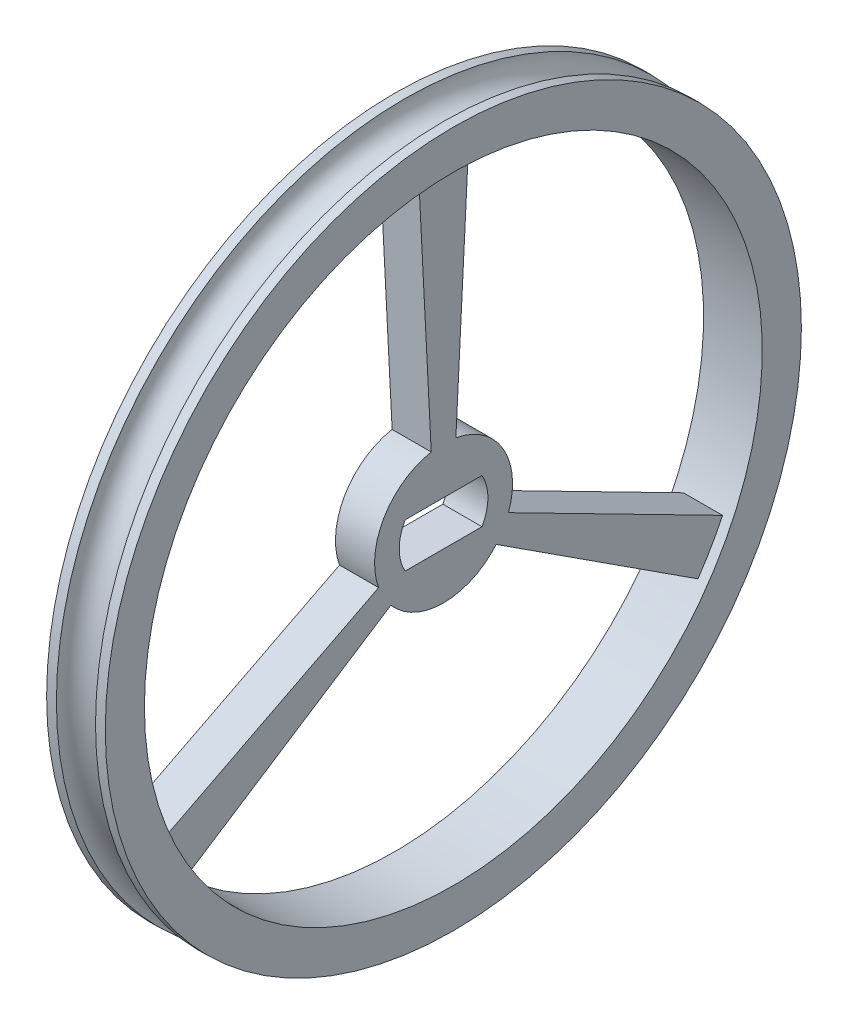
ISO-10303-21;
HEADER;
FILE_DESCRIPTION(('STEP AP214'),'2;1');
FILE_NAME('part.step','',(''),(''),'','','');
FILE_SCHEMA(('AUTOMOTIVE_DESIGN { 1 0 10303 214 1 1 1 1 }'));
ENDSEC;
DATA;
#1=APPLICATION_CONTEXT('core data for automotive mechanical design processes');
#2=APPLICATION_PROTOCOL_DEFINITION('international standard','automotive_design',2000,#1);
#3=PRODUCT_CONTEXT('',#1,'mechanical');
#4=PRODUCT('Part','Part','',(#3));
#5=PRODUCT_RELATED_PRODUCT_CATEGORY('part','',(#4));
#6=PRODUCT_DEFINITION_FORMATION('','',#4);
#7=PRODUCT_DEFINITION_CONTEXT('part definition',#1,'design');
#8=PRODUCT_DEFINITION('design','',#6,#7);
#9=PRODUCT_DEFINITION_SHAPE('','',#8);
#10=(LENGTH_UNIT() NAMED_UNIT(*) SI_UNIT(.MILLI.,.METRE.));
#11=(NAMED_UNIT(*) PLANE_ANGLE_UNIT() SI_UNIT($,.RADIAN.));
#12=(NAMED_UNIT(*) SI_UNIT($,.STERADIAN.) SOLID_ANGLE_UNIT());
#13=UNCERTAINTY_MEASURE_WITH_UNIT(LENGTH_MEASURE(1.E-05),#10,'distance_accuracy_value','');
#14=(GEOMETRIC_REPRESENTATION_CONTEXT(3) GLOBAL_UNCERTAINTY_ASSIGNED_CONTEXT((#13)) GLOBAL_UNIT_ASSIGNED_CONTEXT((#10,
#11,#12)) REPRESENTATION_CONTEXT('',''));
#15=CARTESIAN_POINT('',(0.,0.,0.));
#16=DIRECTION('',(0.,0.,1.));
#17=DIRECTION('',(1.,0.,0.));
#18=AXIS2_PLACEMENT_3D('',#15,#16,#17);
#19=CARTESIAN_POINT('',(0.,0.,0.));
#20=DIRECTION('',(-1.,0.,0.));
#21=DIRECTION('',(0.,0.,1.));
#22=AXIS2_PLACEMENT_3D('',#19,#20,#21);
#23=TOROIDAL_SURFACE('',#22,28.2575,1.5875);
#24=CARTESIAN_POINT('',(-1.5875,0.,0.));
#25=DIRECTION('',(-1.,0.,0.));
#26=DIRECTION('',(0.,0.,1.));
#27=AXIS2_PLACEMENT_3D('',#24,#25,#26);
#28=CIRCLE('',#27,28.2575);
#29=CARTESIAN_POINT('',(-1.5875,0.,28.2575));
#30=VERTEX_POINT('',#29);
#31=EDGE_CURVE('E11',#30,#30,#28,.T.);
#32=ORIENTED_EDGE('',*,*,#31,.F.);
#33=EDGE_LOOP('',(#32));
#34=FACE_BOUND('',#33,.T.);
#35=CARTESIAN_POINT('',(1.5875,0.,0.));
#36=DIRECTION('',(-1.,0.,0.));
#37=DIRECTION('',(0.,0.,1.));
#38=AXIS2_PLACEMENT_3D('',#35,#36,#37);
#39=CIRCLE('',#38,28.2575);
#40=CARTESIAN_POINT('',(1.5875,0.,28.2575));
#41=VERTEX_POINT('',#40);
#42=EDGE_CURVE('E279',#41,#41,#39,.T.);
#43=ORIENTED_EDGE('',*,*,#42,.T.);
#44=EDGE_LOOP('',(#43));
#45=FACE_BOUND('',#44,.T.);
#46=ADVANCED_FACE('F45',(#34,#45),#23,.F.);
#47=CARTESIAN_POINT('',(0.,0.,0.));
#48=DIRECTION('',(-1.,0.,0.));
#49=DIRECTION('',(0.,0.,1.));
#50=AXIS2_PLACEMENT_3D('',#47,#48,#49);
#51=CYLINDRICAL_SURFACE('',#50,28.2575);
#52=CARTESIAN_POINT('',(-2.38125,0.,0.));
#53=DIRECTION('',(-1.,0.,0.));
#54=DIRECTION('',(0.,0.,1.));
#55=AXIS2_PLACEMENT_3D('',#52,#53,#54);
#56=CIRCLE('',#55,28.2575);
#57=CARTESIAN_POINT('',(-2.38125,0.,28.2575));
#58=VERTEX_POINT('',#57);
#59=EDGE_CURVE('E52',#58,#58,#56,.T.);
#60=ORIENTED_EDGE('',*,*,#59,.F.);
#61=EDGE_LOOP('',(#60));
#62=FACE_BOUND('',#61,.T.);
#63=ORIENTED_EDGE('',*,*,#31,.T.);
#64=EDGE_LOOP('',(#63));
#65=FACE_BOUND('',#64,.T.);
#66=ADVANCED_FACE('F297',(#62,#65),#51,.T.);
#67=CARTESIAN_POINT('',(-2.38125,28.2575,0.));
#68=DIRECTION('',(1.,0.,0.));
#69=DIRECTION('',(0.,0.,-1.));
#70=AXIS2_PLACEMENT_3D('',#67,#68,#69);
#71=PLANE('',#70);
#72=CARTESIAN_POINT('',(-2.38125,0.,0.));
#73=DIRECTION('',(-1.,0.,0.));
#74=DIRECTION('',(0.,0.,1.));
#75=AXIS2_PLACEMENT_3D('',#72,#73,#74);
#76=CIRCLE('',#75,25.0825);
#77=CARTESIAN_POINT('',(-2.38125,0.,25.0825));
#78=VERTEX_POINT('',#77);
#79=EDGE_CURVE('E290',#78,#78,#76,.T.);
#80=ORIENTED_EDGE('',*,*,#79,.F.);
#81=EDGE_LOOP('',(#80));
#82=FACE_BOUND('',#81,.T.);
#83=ORIENTED_EDGE('',*,*,#59,.T.);
#84=EDGE_LOOP('',(#83));
#85=FACE_BOUND('',#84,.T.);
#86=ADVANCED_FACE('F295',(#82,#85),#71,.F.);
#87=CARTESIAN_POINT('',(0.,0.,0.));
#88=DIRECTION('',(-1.,0.,0.));
#89=DIRECTION('',(0.,0.,1.));
#90=AXIS2_PLACEMENT_3D('',#87,#88,#89);
#91=CYLINDRICAL_SURFACE('',#90,25.0825);
#92=DIRECTION('',(1.,0.,0.));
#93=VECTOR('',#92,1.);
#94=CARTESIAN_POINT('',(0.,-14.2333688005845,20.6529179254784));
#95=LINE('',#94,#93);
#96=CARTESIAN_POINT('',(-1.5875,-14.2333688005845,20.6529179254784));
#97=VERTEX_POINT('',#96);
#98=CARTESIAN_POINT('',(1.5875,-14.2333688005845,20.6529179254784));
#99=VERTEX_POINT('',#98);
#100=EDGE_CURVE('E59',#97,#99,#95,.T.);
#101=ORIENTED_EDGE('',*,*,#100,.T.);
#102=CARTESIAN_POINT('',(1.5875,0.,0.));
#103=DIRECTION('',(1.,0.,0.));
#104=DIRECTION('',(0.,0.866025403784443,0.499999999999992));
#105=AXIS2_PLACEMENT_3D('',#102,#103,#104);
#106=CIRCLE('',#105,25.0825);
#107=CARTESIAN_POINT('',(1.5875,-10.7692671854467,22.6529179254784));
#108=VERTEX_POINT('',#107);
#109=EDGE_CURVE('E63',#108,#99,#106,.T.);
#110=ORIENTED_EDGE('',*,*,#109,.F.);
#111=DIRECTION('',(1.,0.,0.));
#112=VECTOR('',#111,1.);
#113=CARTESIAN_POINT('',(0.,-10.7692671854467,22.6529179254784));
#114=LINE('',#113,#112);
#115=CARTESIAN_POINT('',(-1.5875,-10.7692671854467,22.6529179254784));
#116=VERTEX_POINT('',#115);
#117=EDGE_CURVE('E225',#116,#108,#114,.T.);
#118=ORIENTED_EDGE('',*,*,#117,.F.);
#119=CARTESIAN_POINT('',(-1.5875,0.,0.));
#120=DIRECTION('',(1.,0.,0.));
#121=DIRECTION('',(0.,0.866025403784443,0.499999999999992));
#122=AXIS2_PLACEMENT_3D('',#119,#120,#121);
#123=CIRCLE('',#122,25.0825);
#124=EDGE_CURVE('E218',#116,#97,#123,.T.);
#125=ORIENTED_EDGE('',*,*,#124,.T.);
#126=EDGE_LOOP('',(#101,#110,#118,#125));
#127=FACE_BOUND('',#126,.T.);
#128=DIRECTION('',(1.,0.,0.));
#129=VECTOR('',#128,1.);
#130=CARTESIAN_POINT('',(0.,-10.769267185447,-22.6529179254783));
#131=LINE('',#130,#129);
#132=CARTESIAN_POINT('',(-1.5875,-10.769267185447,-22.6529179254783));
#133=VERTEX_POINT('',#132);
#134=CARTESIAN_POINT('',(1.5875,-10.769267185447,-22.6529179254783));
#135=VERTEX_POINT('',#134);
#136=EDGE_CURVE('E248',#133,#135,#131,.T.);
#137=ORIENTED_EDGE('',*,*,#136,.T.);
#138=CARTESIAN_POINT('',(1.5875,0.,0.));
#139=DIRECTION('',(1.,0.,0.));
#140=DIRECTION('',(0.,-0.866025403784436,0.500000000000004));
#141=AXIS2_PLACEMENT_3D('',#138,#139,#140);
#142=CIRCLE('',#141,25.0825);
#143=CARTESIAN_POINT('',(1.5875,-14.2333688005848,-20.6529179254783));
#144=VERTEX_POINT('',#143);
#145=EDGE_CURVE('E234',#144,#135,#142,.T.);
#146=ORIENTED_EDGE('',*,*,#145,.F.);
#147=DIRECTION('',(1.,0.,0.));
#148=VECTOR('',#147,1.);
#149=CARTESIAN_POINT('',(0.,-14.2333688005848,-20.6529179254783));
#150=LINE('',#149,#148);
#151=CARTESIAN_POINT('',(-1.5875,-14.2333688005848,-20.6529179254783));
#152=VERTEX_POINT('',#151);
#153=EDGE_CURVE('E250',#152,#144,#150,.T.);
#154=ORIENTED_EDGE('',*,*,#153,.F.);
#155=CARTESIAN_POINT('',(-1.5875,0.,0.));
#156=DIRECTION('',(1.,0.,0.));
#157=DIRECTION('',(0.,-0.866025403784436,0.500000000000004));
#158=AXIS2_PLACEMENT_3D('',#155,#156,#157);
#159=CIRCLE('',#158,25.0825);
#160=EDGE_CURVE('E242',#152,#133,#159,.T.);
#161=ORIENTED_EDGE('',*,*,#160,.T.);
#162=EDGE_LOOP('',(#137,#146,#154,#161));
#163=FACE_BOUND('',#162,.T.);
#164=DIRECTION('',(1.,0.,0.));
#165=VECTOR('',#164,1.);
#166=CARTESIAN_POINT('',(0.,25.0026359860316,2.));
#167=LINE('',#166,#165);
#168=CARTESIAN_POINT('',(-1.5875,25.0026359860316,2.));
#169=VERTEX_POINT('',#168);
#170=CARTESIAN_POINT('',(1.5875,25.0026359860316,2.));
#171=VERTEX_POINT('',#170);
#172=EDGE_CURVE('E274',#169,#171,#167,.T.);
#173=ORIENTED_EDGE('',*,*,#172,.T.);
#174=CARTESIAN_POINT('',(1.5875,0.,0.));
#175=DIRECTION('',(1.,0.,0.));
#176=DIRECTION('',(0.,0.,-1.));
#177=AXIS2_PLACEMENT_3D('',#174,#175,#176);
#178=CIRCLE('',#177,25.0825);
#179=CARTESIAN_POINT('',(1.5875,25.0026359860316,-2.));
#180=VERTEX_POINT('',#179);
#181=EDGE_CURVE('E260',#180,#171,#178,.T.);
#182=ORIENTED_EDGE('',*,*,#181,.F.);
#183=DIRECTION('',(1.,0.,0.));
#184=VECTOR('',#183,1.);
#185=CARTESIAN_POINT('',(0.,25.0026359860316,-2.));
#186=LINE('',#185,#184);
#187=CARTESIAN_POINT('',(-1.5875,25.0026359860316,-2.));
#188=VERTEX_POINT('',#187);
#189=EDGE_CURVE('E276',#188,#180,#186,.T.);
#190=ORIENTED_EDGE('',*,*,#189,.F.);
#191=CARTESIAN_POINT('',(-1.5875,0.,0.));
#192=DIRECTION('',(1.,0.,0.));
#193=DIRECTION('',(0.,0.,-1.));
#194=AXIS2_PLACEMENT_3D('',#191,#192,#193);
#195=CIRCLE('',#194,25.0825);
#196=EDGE_CURVE('E268',#188,#169,#195,.T.);
#197=ORIENTED_EDGE('',*,*,#196,.T.);
#198=EDGE_LOOP('',(#173,#182,#190,#197));
#199=FACE_BOUND('',#198,.T.);
#200=CARTESIAN_POINT('',(2.38125,0.,0.));
#201=DIRECTION('',(-1.,0.,0.));
#202=DIRECTION('',(0.,0.,1.));
#203=AXIS2_PLACEMENT_3D('',#200,#201,#202);
#204=CIRCLE('',#203,25.0825);
#205=CARTESIAN_POINT('',(2.38125,0.,25.0825));
#206=VERTEX_POINT('',#205);
#207=EDGE_CURVE('E287',#206,#206,#204,.T.);
#208=ORIENTED_EDGE('',*,*,#207,.F.);
#209=EDGE_LOOP('',(#208));
#210=FACE_BOUND('',#209,.T.);
#211=ORIENTED_EDGE('',*,*,#79,.T.);
#212=EDGE_LOOP('',(#211));
#213=FACE_BOUND('',#212,.T.);
#214=ADVANCED_FACE('F316',(#127,#163,#199,#210,#213),#91,.F.);
#215=CARTESIAN_POINT('',(2.38125,25.0825,0.));
#216=DIRECTION('',(-1.,0.,0.));
#217=DIRECTION('',(0.,0.,1.));
#218=AXIS2_PLACEMENT_3D('',#215,#216,#217);
#219=PLANE('',#218);
#220=CARTESIAN_POINT('',(2.38125,0.,0.));
#221=DIRECTION('',(-1.,0.,0.));
#222=DIRECTION('',(0.,0.,1.));
#223=AXIS2_PLACEMENT_3D('',#220,#221,#222);
#224=CIRCLE('',#223,28.2575);
#225=CARTESIAN_POINT('',(2.38125,0.,28.2575));
#226=VERTEX_POINT('',#225);
#227=EDGE_CURVE('E284',#226,#226,#224,.T.);
#228=ORIENTED_EDGE('',*,*,#227,.F.);
#229=EDGE_LOOP('',(#228));
#230=FACE_BOUND('',#229,.T.);
#231=ORIENTED_EDGE('',*,*,#207,.T.);
#232=EDGE_LOOP('',(#231));
#233=FACE_BOUND('',#232,.T.);
#234=ADVANCED_FACE('F310',(#230,#233),#219,.F.);
#235=CARTESIAN_POINT('',(0.,0.,0.));
#236=DIRECTION('',(-1.,0.,0.));
#237=DIRECTION('',(0.,0.,1.));
#238=AXIS2_PLACEMENT_3D('',#235,#236,#237);
#239=CYLINDRICAL_SURFACE('',#238,28.2575);
#240=ORIENTED_EDGE('',*,*,#42,.F.);
#241=EDGE_LOOP('',(#240));
#242=FACE_BOUND('',#241,.T.);
#243=ORIENTED_EDGE('',*,*,#227,.T.);
#244=EDGE_LOOP('',(#243));
#245=FACE_BOUND('',#244,.T.);
#246=ADVANCED_FACE('F306',(#242,#245),#239,.T.);
#247=CARTESIAN_POINT('',(0.,5.50999092558236,1.));
#248=DIRECTION('',(0.,-0.0512340255416818,0.998686674901991));
#249=DIRECTION('',(0.,-0.998686674901991,-0.0512340255416818));
#250=AXIS2_PLACEMENT_3D('',#247,#248,#249);
#251=PLANE('',#250);
#252=ORIENTED_EDGE('',*,*,#172,.F.);
#253=DIRECTION('',(0.,-0.998686674901991,-0.0512340255416818));
#254=VECTOR('',#253,1.);
#255=CARTESIAN_POINT('',(-1.5875,5.50999092558236,1.));
#256=LINE('',#255,#254);
#257=CARTESIAN_POINT('',(-1.5875,5.50999092558236,1.));
#258=VERTEX_POINT('',#257);
#259=EDGE_CURVE('E266',#169,#258,#256,.T.);
#260=ORIENTED_EDGE('',*,*,#259,.T.);
#261=DIRECTION('',(1.,0.,0.));
#262=VECTOR('',#261,1.);
#263=CARTESIAN_POINT('',(0.,5.50999092558236,1.));
#264=LINE('',#263,#262);
#265=CARTESIAN_POINT('',(1.5875,5.50999092558236,1.));
#266=VERTEX_POINT('',#265);
#267=EDGE_CURVE('E272',#258,#266,#264,.T.);
#268=ORIENTED_EDGE('',*,*,#267,.T.);
#269=DIRECTION('',(0.,-0.998686674901991,-0.0512340255416818));
#270=VECTOR('',#269,1.);
#271=CARTESIAN_POINT('',(1.5875,5.50999092558236,1.));
#272=LINE('',#271,#270);
#273=EDGE_CURVE('E256',#171,#266,#272,.T.);
#274=ORIENTED_EDGE('',*,*,#273,.F.);
#275=EDGE_LOOP('',(#252,#260,#268,#274));
#276=FACE_BOUND('',#275,.T.);
#277=ADVANCED_FACE('F309',(#276),#251,.T.);
#278=CARTESIAN_POINT('',(0.,5.50999092558236,-1.));
#279=DIRECTION('',(0.,-0.0512340255416818,-0.998686674901991));
#280=DIRECTION('',(0.,0.998686674901991,-0.0512340255416818));
#281=AXIS2_PLACEMENT_3D('',#278,#279,#280);
#282=PLANE('',#281);
#283=DIRECTION('',(0.,0.998686674901991,-0.0512340255416818));
#284=VECTOR('',#283,1.);
#285=CARTESIAN_POINT('',(-1.5875,5.50999092558236,-1.));
#286=LINE('',#285,#284);
#287=CARTESIAN_POINT('',(-1.5875,5.50999092558236,-1.));
#288=VERTEX_POINT('',#287);
#289=EDGE_CURVE('E253',#288,#188,#286,.T.);
#290=ORIENTED_EDGE('',*,*,#289,.T.);
#291=ORIENTED_EDGE('',*,*,#189,.T.);
#292=DIRECTION('',(0.,0.998686674901991,-0.0512340255416818));
#293=VECTOR('',#292,1.);
#294=CARTESIAN_POINT('',(1.5875,5.50999092558236,-1.));
#295=LINE('',#294,#293);
#296=CARTESIAN_POINT('',(1.5875,5.50999092558236,-1.));
#297=VERTEX_POINT('',#296);
#298=EDGE_CURVE('E263',#297,#180,#295,.T.);
#299=ORIENTED_EDGE('',*,*,#298,.F.);
#300=DIRECTION('',(1.,0.,0.));
#301=VECTOR('',#300,1.);
#302=CARTESIAN_POINT('',(0.,5.50999092558236,-1.));
#303=LINE('',#302,#301);
#304=EDGE_CURVE('E259',#288,#297,#303,.T.);
#305=ORIENTED_EDGE('',*,*,#304,.F.);
#306=EDGE_LOOP('',(#290,#291,#299,#305));
#307=FACE_BOUND('',#306,.T.);
#308=ADVANCED_FACE('F330',(#307),#282,.T.);
#309=CARTESIAN_POINT('',(1.5875,0.,0.));
#310=DIRECTION('',(1.,0.,0.));
#311=DIRECTION('',(0.,0.,-1.));
#312=AXIS2_PLACEMENT_3D('',#309,#310,#311);
#313=PLANE('',#312);
#314=ORIENTED_EDGE('',*,*,#273,.T.);
#315=CARTESIAN_POINT('',(1.5875,0.,0.));
#316=DIRECTION('',(1.,0.,0.));
#317=DIRECTION('',(0.,0.,-1.));
#318=AXIS2_PLACEMENT_3D('',#315,#316,#317);
#319=CIRCLE('',#318,5.6);
#320=CARTESIAN_POINT('',(1.5875,-1.88897005900669,5.27179211617608));
#321=VERTEX_POINT('',#320);
#322=EDGE_CURVE('E186',#266,#321,#319,.T.);
#323=ORIENTED_EDGE('',*,*,#322,.T.);
#324=DIRECTION('',(0.,-0.45497336979375,0.89050504365698));
#325=VECTOR('',#324,1.);
#326=CARTESIAN_POINT('',(1.5875,-1.88897005900669,5.27179211617608));
#327=LINE('',#326,#325);
#328=EDGE_CURVE('E213',#321,#108,#327,.T.);
#329=ORIENTED_EDGE('',*,*,#328,.T.);
#330=ORIENTED_EDGE('',*,*,#109,.T.);
#331=DIRECTION('',(0.,0.543713305108225,-0.839271018115299));
#332=VECTOR('',#331,1.);
#333=CARTESIAN_POINT('',(1.5875,-3.62102086657558,4.27179211617609));
#334=LINE('',#333,#332);
#335=CARTESIAN_POINT('',(1.5875,-3.62102086657558,4.27179211617609));
#336=VERTEX_POINT('',#335);
#337=EDGE_CURVE('E208',#99,#336,#334,.T.);
#338=ORIENTED_EDGE('',*,*,#337,.T.);
#339=CARTESIAN_POINT('',(1.5875,-3.62102086657564,-4.27179211617604));
#340=VERTEX_POINT('',#339);
#341=EDGE_CURVE('E184',#336,#340,#319,.T.);
#342=ORIENTED_EDGE('',*,*,#341,.T.);
#343=DIRECTION('',(0.,-0.543713305108236,-0.839271018115292));
#344=VECTOR('',#343,1.);
#345=CARTESIAN_POINT('',(1.5875,-3.62102086657564,-4.27179211617604));
#346=LINE('',#345,#344);
#347=EDGE_CURVE('E237',#340,#144,#346,.T.);
#348=ORIENTED_EDGE('',*,*,#347,.T.);
#349=ORIENTED_EDGE('',*,*,#145,.T.);
#350=DIRECTION('',(0.,0.454973369793762,0.890505043656974));
#351=VECTOR('',#350,1.);
#352=CARTESIAN_POINT('',(1.5875,-1.88897005900677,-5.27179211617605));
#353=LINE('',#352,#351);
#354=CARTESIAN_POINT('',(1.5875,-1.88897005900677,-5.27179211617605));
#355=VERTEX_POINT('',#354);
#356=EDGE_CURVE('E230',#135,#355,#353,.T.);
#357=ORIENTED_EDGE('',*,*,#356,.T.);
#358=EDGE_CURVE('E181',#355,#297,#319,.T.);
#359=ORIENTED_EDGE('',*,*,#358,.T.);
#360=ORIENTED_EDGE('',*,*,#298,.T.);
#361=ORIENTED_EDGE('',*,*,#181,.T.);
#362=EDGE_LOOP('',(#314,#323,#329,#330,#338,#342,#348,#349,#357,#359,#360,#361));
#363=FACE_BOUND('',#362,.T.);
#364=CARTESIAN_POINT('',(1.5875,0.,0.));
#365=DIRECTION('',(1.,0.,0.));
#366=DIRECTION('',(0.,0.,-1.));
#367=AXIS2_PLACEMENT_3D('',#364,#365,#366);
#368=CIRCLE('',#367,3.6);
#369=CARTESIAN_POINT('',(1.5875,1.8,3.11769145362398));
#370=VERTEX_POINT('',#369);
#371=CARTESIAN_POINT('',(1.5875,-1.8,3.11769145362398));
#372=VERTEX_POINT('',#371);
#373=EDGE_CURVE('E169',#370,#372,#368,.T.);
#374=ORIENTED_EDGE('',*,*,#373,.F.);
#375=DIRECTION('',(0.,0.,-1.));
#376=VECTOR('',#375,1.);
#377=CARTESIAN_POINT('',(1.5875,1.8,0.));
#378=LINE('',#377,#376);
#379=CARTESIAN_POINT('',(1.5875,1.8,-3.11769145362398));
#380=VERTEX_POINT('',#379);
#381=EDGE_CURVE('E174',#380,#370,#378,.F.);
#382=ORIENTED_EDGE('',*,*,#381,.F.);
#383=CARTESIAN_POINT('',(1.5875,0.,0.));
#384=DIRECTION('',(1.,0.,0.));
#385=DIRECTION('',(0.,0.,-1.));
#386=AXIS2_PLACEMENT_3D('',#383,#384,#385);
#387=CIRCLE('',#386,3.6);
#388=CARTESIAN_POINT('',(1.5875,-1.8,-3.11769145362398));
#389=VERTEX_POINT('',#388);
#390=EDGE_CURVE('E180',#389,#380,#387,.T.);
#391=ORIENTED_EDGE('',*,*,#390,.F.);
#392=DIRECTION('',(0.,0.,-1.));
#393=VECTOR('',#392,1.);
#394=CARTESIAN_POINT('',(1.5875,-1.8,0.));
#395=LINE('',#394,#393);
#396=EDGE_CURVE('E159',#372,#389,#395,.T.);
#397=ORIENTED_EDGE('',*,*,#396,.F.);
#398=EDGE_LOOP('',(#374,#382,#391,#397));
#399=FACE_BOUND('',#398,.T.);
#400=ADVANCED_FACE('F178',(#363,#399),#313,.T.);
#401=CARTESIAN_POINT('',(-1.5875,0.,0.));
#402=DIRECTION('',(1.,0.,0.));
#403=DIRECTION('',(0.,0.,-1.));
#404=AXIS2_PLACEMENT_3D('',#401,#402,#403);
#405=PLANE('',#404);
#406=ORIENTED_EDGE('',*,*,#289,.F.);
#407=CARTESIAN_POINT('',(-1.5875,0.,0.));
#408=DIRECTION('',(1.,0.,0.));
#409=DIRECTION('',(0.,0.,-1.));
#410=AXIS2_PLACEMENT_3D('',#407,#408,#409);
#411=CIRCLE('',#410,5.6);
#412=CARTESIAN_POINT('',(-1.5875,-1.88897005900677,-5.27179211617605));
#413=VERTEX_POINT('',#412);
#414=EDGE_CURVE('E194',#413,#288,#411,.T.);
#415=ORIENTED_EDGE('',*,*,#414,.F.);
#416=DIRECTION('',(0.,0.454973369793762,0.890505043656974));
#417=VECTOR('',#416,1.);
#418=CARTESIAN_POINT('',(-1.5875,-1.88897005900677,-5.27179211617605));
#419=LINE('',#418,#417);
#420=EDGE_CURVE('E240',#133,#413,#419,.T.);
#421=ORIENTED_EDGE('',*,*,#420,.F.);
#422=ORIENTED_EDGE('',*,*,#160,.F.);
#423=DIRECTION('',(0.,-0.543713305108236,-0.839271018115292));
#424=VECTOR('',#423,1.);
#425=CARTESIAN_POINT('',(-1.5875,-3.62102086657564,-4.27179211617604));
#426=LINE('',#425,#424);
#427=CARTESIAN_POINT('',(-1.5875,-3.62102086657564,-4.27179211617604));
#428=VERTEX_POINT('',#427);
#429=EDGE_CURVE('E227',#428,#152,#426,.T.);
#430=ORIENTED_EDGE('',*,*,#429,.F.);
#431=CARTESIAN_POINT('',(-1.5875,-3.62102086657558,4.27179211617609));
#432=VERTEX_POINT('',#431);
#433=EDGE_CURVE('E201',#432,#428,#411,.T.);
#434=ORIENTED_EDGE('',*,*,#433,.F.);
#435=DIRECTION('',(0.,0.543713305108225,-0.839271018115299));
#436=VECTOR('',#435,1.);
#437=CARTESIAN_POINT('',(-1.5875,-3.62102086657558,4.27179211617609));
#438=LINE('',#437,#436);
#439=EDGE_CURVE('E216',#97,#432,#438,.T.);
#440=ORIENTED_EDGE('',*,*,#439,.F.);
#441=ORIENTED_EDGE('',*,*,#124,.F.);
#442=DIRECTION('',(0.,-0.45497336979375,0.89050504365698));
#443=VECTOR('',#442,1.);
#444=CARTESIAN_POINT('',(-1.5875,-1.88897005900669,5.27179211617608));
#445=LINE('',#444,#443);
#446=CARTESIAN_POINT('',(-1.5875,-1.8889700590067,5.27179211617608));
#447=VERTEX_POINT('',#446);
#448=EDGE_CURVE('E206',#447,#116,#445,.T.);
#449=ORIENTED_EDGE('',*,*,#448,.F.);
#450=EDGE_CURVE('E175',#258,#447,#411,.T.);
#451=ORIENTED_EDGE('',*,*,#450,.F.);
#452=ORIENTED_EDGE('',*,*,#259,.F.);
#453=ORIENTED_EDGE('',*,*,#196,.F.);
#454=EDGE_LOOP('',(#406,#415,#421,#422,#430,#434,#440,#441,#449,#451,#452,#453));
#455=FACE_BOUND('',#454,.T.);
#456=CARTESIAN_POINT('',(-1.5875,0.,0.));
#457=DIRECTION('',(1.,0.,0.));
#458=DIRECTION('',(0.,0.,-1.));
#459=AXIS2_PLACEMENT_3D('',#456,#457,#458);
#460=CIRCLE('',#459,3.6);
#461=CARTESIAN_POINT('',(-1.5875,1.8,3.11769145362398));
#462=VERTEX_POINT('',#461);
#463=CARTESIAN_POINT('',(-1.5875,-1.8,3.11769145362398));
#464=VERTEX_POINT('',#463);
#465=EDGE_CURVE('E190',#462,#464,#460,.T.);
#466=ORIENTED_EDGE('',*,*,#465,.T.);
#467=DIRECTION('',(0.,0.,-1.));
#468=VECTOR('',#467,1.);
#469=CARTESIAN_POINT('',(-1.5875,-1.8,0.));
#470=LINE('',#469,#468);
#471=CARTESIAN_POINT('',(-1.5875,-1.8,-3.11769145362398));
#472=VERTEX_POINT('',#471);
#473=EDGE_CURVE('E161',#464,#472,#470,.T.);
#474=ORIENTED_EDGE('',*,*,#473,.T.);
#475=CARTESIAN_POINT('',(-1.5875,0.,0.));
#476=DIRECTION('',(1.,0.,0.));
#477=DIRECTION('',(0.,0.,-1.));
#478=AXIS2_PLACEMENT_3D('',#475,#476,#477);
#479=CIRCLE('',#478,3.6);
#480=CARTESIAN_POINT('',(-1.5875,1.8,-3.11769145362398));
#481=VERTEX_POINT('',#480);
#482=EDGE_CURVE('E195',#472,#481,#479,.T.);
#483=ORIENTED_EDGE('',*,*,#482,.T.);
#484=DIRECTION('',(0.,0.,-1.));
#485=VECTOR('',#484,1.);
#486=CARTESIAN_POINT('',(-1.5875,1.8,0.));
#487=LINE('',#486,#485);
#488=EDGE_CURVE('E192',#481,#462,#487,.F.);
#489=ORIENTED_EDGE('',*,*,#488,.T.);
#490=EDGE_LOOP('',(#466,#474,#483,#489));
#491=FACE_BOUND('',#490,.T.);
#492=ADVANCED_FACE('F337',(#455,#491),#405,.F.);
#493=CARTESIAN_POINT('',(0.,-1.88897005900677,-5.27179211617605));
#494=DIRECTION('',(0.,0.890505043656974,-0.454973369793762));
#495=DIRECTION('',(0.,0.454973369793762,0.890505043656974));
#496=AXIS2_PLACEMENT_3D('',#493,#494,#495);
#497=PLANE('',#496);
#498=ORIENTED_EDGE('',*,*,#136,.F.);
#499=ORIENTED_EDGE('',*,*,#420,.T.);
#500=DIRECTION('',(1.,0.,0.));
#501=VECTOR('',#500,1.);
#502=CARTESIAN_POINT('',(0.,-1.88897005900677,-5.27179211617605));
#503=LINE('',#502,#501);
#504=EDGE_CURVE('E246',#413,#355,#503,.T.);
#505=ORIENTED_EDGE('',*,*,#504,.T.);
#506=ORIENTED_EDGE('',*,*,#356,.F.);
#507=EDGE_LOOP('',(#498,#499,#505,#506));
#508=FACE_BOUND('',#507,.T.);
#509=ADVANCED_FACE('F340',(#508),#497,.T.);
#510=CARTESIAN_POINT('',(0.,-3.62102086657564,-4.27179211617604));
#511=DIRECTION('',(0.,-0.839271018115292,0.543713305108237));
#512=DIRECTION('',(0.,-0.543713305108236,-0.839271018115292));
#513=AXIS2_PLACEMENT_3D('',#510,#511,#512);
#514=PLANE('',#513);
#515=ORIENTED_EDGE('',*,*,#429,.T.);
#516=ORIENTED_EDGE('',*,*,#153,.T.);
#517=ORIENTED_EDGE('',*,*,#347,.F.);
#518=DIRECTION('',(1.,0.,0.));
#519=VECTOR('',#518,1.);
#520=CARTESIAN_POINT('',(0.,-3.62102086657564,-4.27179211617604));
#521=LINE('',#520,#519);
#522=EDGE_CURVE('E233',#428,#340,#521,.T.);
#523=ORIENTED_EDGE('',*,*,#522,.F.);
#524=EDGE_LOOP('',(#515,#516,#517,#523));
#525=FACE_BOUND('',#524,.T.);
#526=ADVANCED_FACE('F345',(#525),#514,.T.);
#527=CARTESIAN_POINT('',(0.,-3.62102086657558,4.27179211617609));
#528=DIRECTION('',(0.,-0.839271018115299,-0.543713305108225));
#529=DIRECTION('',(0.,0.543713305108225,-0.839271018115299));
#530=AXIS2_PLACEMENT_3D('',#527,#528,#529);
#531=PLANE('',#530);
#532=ORIENTED_EDGE('',*,*,#100,.F.);
#533=ORIENTED_EDGE('',*,*,#439,.T.);
#534=DIRECTION('',(1.,0.,0.));
#535=VECTOR('',#534,1.);
#536=CARTESIAN_POINT('',(0.,-3.62102086657558,4.27179211617609));
#537=LINE('',#536,#535);
#538=EDGE_CURVE('E222',#432,#336,#537,.T.);
#539=ORIENTED_EDGE('',*,*,#538,.T.);
#540=ORIENTED_EDGE('',*,*,#337,.F.);
#541=EDGE_LOOP('',(#532,#533,#539,#540));
#542=FACE_BOUND('',#541,.T.);
#543=ADVANCED_FACE('F348',(#542),#531,.T.);
#544=CARTESIAN_POINT('',(0.,-1.88897005900669,5.27179211617608));
#545=DIRECTION('',(0.,0.89050504365698,0.45497336979375));
#546=DIRECTION('',(0.,-0.45497336979375,0.89050504365698));
#547=AXIS2_PLACEMENT_3D('',#544,#545,#546);
#548=PLANE('',#547);
#549=ORIENTED_EDGE('',*,*,#448,.T.);
#550=ORIENTED_EDGE('',*,*,#117,.T.);
#551=ORIENTED_EDGE('',*,*,#328,.F.);
#552=DIRECTION('',(1.,0.,0.));
#553=VECTOR('',#552,1.);
#554=CARTESIAN_POINT('',(0.,-1.88897005900669,5.27179211617608));
#555=LINE('',#554,#553);
#556=EDGE_CURVE('E211',#447,#321,#555,.T.);
#557=ORIENTED_EDGE('',*,*,#556,.F.);
#558=EDGE_LOOP('',(#549,#550,#551,#557));
#559=FACE_BOUND('',#558,.T.);
#560=ADVANCED_FACE('F353',(#559),#548,.T.);
#561=CARTESIAN_POINT('',(0.,0.,0.));
#562=DIRECTION('',(1.,0.,0.));
#563=DIRECTION('',(0.,0.,-1.));
#564=AXIS2_PLACEMENT_3D('',#561,#562,#563);
#565=CYLINDRICAL_SURFACE('',#564,5.6);
#566=ORIENTED_EDGE('',*,*,#322,.F.);
#567=ORIENTED_EDGE('',*,*,#267,.F.);
#568=ORIENTED_EDGE('',*,*,#450,.T.);
#569=ORIENTED_EDGE('',*,*,#556,.T.);
#570=EDGE_LOOP('',(#566,#567,#568,#569));
#571=FACE_BOUND('',#570,.T.);
#572=ADVANCED_FACE('F356',(#571),#565,.T.);
#573=ORIENTED_EDGE('',*,*,#414,.T.);
#574=ORIENTED_EDGE('',*,*,#304,.T.);
#575=ORIENTED_EDGE('',*,*,#358,.F.);
#576=ORIENTED_EDGE('',*,*,#504,.F.);
#577=EDGE_LOOP('',(#573,#574,#575,#576));
#578=FACE_BOUND('',#577,.T.);
#579=ADVANCED_FACE('F366',(#578),#565,.T.);
#580=CARTESIAN_POINT('',(0.,0.,0.));
#581=DIRECTION('',(1.,0.,0.));
#582=DIRECTION('',(0.,0.,-1.));
#583=AXIS2_PLACEMENT_3D('',#580,#581,#582);
#584=CYLINDRICAL_SURFACE('',#583,3.6);
#585=DIRECTION('',(1.,0.,0.));
#586=VECTOR('',#585,1.);
#587=CARTESIAN_POINT('',(0.,1.8,-3.11769145362398));
#588=LINE('',#587,#586);
#589=EDGE_CURVE('E204',#481,#380,#588,.T.);
#590=ORIENTED_EDGE('',*,*,#589,.F.);
#591=ORIENTED_EDGE('',*,*,#482,.F.);
#592=DIRECTION('',(1.,0.,0.));
#593=VECTOR('',#592,1.);
#594=CARTESIAN_POINT('',(0.,-1.8,-3.11769145362398));
#595=LINE('',#594,#593);
#596=EDGE_CURVE('E165',#472,#389,#595,.T.);
#597=ORIENTED_EDGE('',*,*,#596,.T.);
#598=ORIENTED_EDGE('',*,*,#390,.T.);
#599=EDGE_LOOP('',(#590,#591,#597,#598));
#600=FACE_BOUND('',#599,.T.);
#601=ADVANCED_FACE('F370',(#600),#584,.F.);
#602=CARTESIAN_POINT('',(0.,-1.8,3.11769145362398));
#603=DIRECTION('',(0.,-1.,0.));
#604=DIRECTION('',(0.,0.,-1.));
#605=AXIS2_PLACEMENT_3D('',#602,#603,#604);
#606=PLANE('',#605);
#607=ORIENTED_EDGE('',*,*,#596,.F.);
#608=ORIENTED_EDGE('',*,*,#473,.F.);
#609=DIRECTION('',(1.,0.,0.));
#610=VECTOR('',#609,1.);
#611=CARTESIAN_POINT('',(0.,-1.8,3.11769145362398));
#612=LINE('',#611,#610);
#613=EDGE_CURVE('E155',#464,#372,#612,.T.);
#614=ORIENTED_EDGE('',*,*,#613,.T.);
#615=ORIENTED_EDGE('',*,*,#396,.T.);
#616=EDGE_LOOP('',(#607,#608,#614,#615));
#617=FACE_BOUND('',#616,.T.);
#618=ADVANCED_FACE('F157',(#617),#606,.F.);
#619=CARTESIAN_POINT('',(0.,0.,0.));
#620=DIRECTION('',(1.,0.,0.));
#621=DIRECTION('',(0.,0.,-1.));
#622=AXIS2_PLACEMENT_3D('',#619,#620,#621);
#623=CYLINDRICAL_SURFACE('',#622,3.6);
#624=ORIENTED_EDGE('',*,*,#613,.F.);
#625=ORIENTED_EDGE('',*,*,#465,.F.);
#626=DIRECTION('',(1.,0.,0.));
#627=VECTOR('',#626,1.);
#628=CARTESIAN_POINT('',(0.,1.8,3.11769145362398));
#629=LINE('',#628,#627);
#630=EDGE_CURVE('E166',#462,#370,#629,.T.);
#631=ORIENTED_EDGE('',*,*,#630,.T.);
#632=ORIENTED_EDGE('',*,*,#373,.T.);
#633=EDGE_LOOP('',(#624,#625,#631,#632));
#634=FACE_BOUND('',#633,.T.);
#635=ADVANCED_FACE('F170',(#634),#623,.F.);
#636=CARTESIAN_POINT('',(0.,1.8,3.11769145362398));
#637=DIRECTION('',(0.,1.,0.));
#638=DIRECTION('',(0.,0.,1.));
#639=AXIS2_PLACEMENT_3D('',#636,#637,#638);
#640=PLANE('',#639);
#641=ORIENTED_EDGE('',*,*,#488,.F.);
#642=ORIENTED_EDGE('',*,*,#589,.T.);
#643=ORIENTED_EDGE('',*,*,#381,.T.);
#644=ORIENTED_EDGE('',*,*,#630,.F.);
#645=EDGE_LOOP('',(#641,#642,#643,#644));
#646=FACE_BOUND('',#645,.T.);
#647=ADVANCED_FACE('F364',(#646),#640,.F.);
#648=ORIENTED_EDGE('',*,*,#433,.T.);
#649=ORIENTED_EDGE('',*,*,#522,.T.);
#650=ORIENTED_EDGE('',*,*,#341,.F.);
#651=ORIENTED_EDGE('',*,*,#538,.F.);
#652=EDGE_LOOP('',(#648,#649,#650,#651));
#653=FACE_BOUND('',#652,.T.);
#654=ADVANCED_FACE('F361',(#653),#565,.T.);
#655=CLOSED_SHELL('',(#46,#66,#86,#214,#234,#246,#277,#308,#400,#492,#509,#526,#543,#560,#572,
#579,#601,#618,#635,#647,#654));
#656=MANIFOLD_SOLID_BREP('B2',#655);
#657=ADVANCED_BREP_SHAPE_REPRESENTATION('',(#18,#656),#14);
#658=SHAPE_DEFINITION_REPRESENTATION(#9,#657);
ENDSEC;
END-ISO-10303-21;
